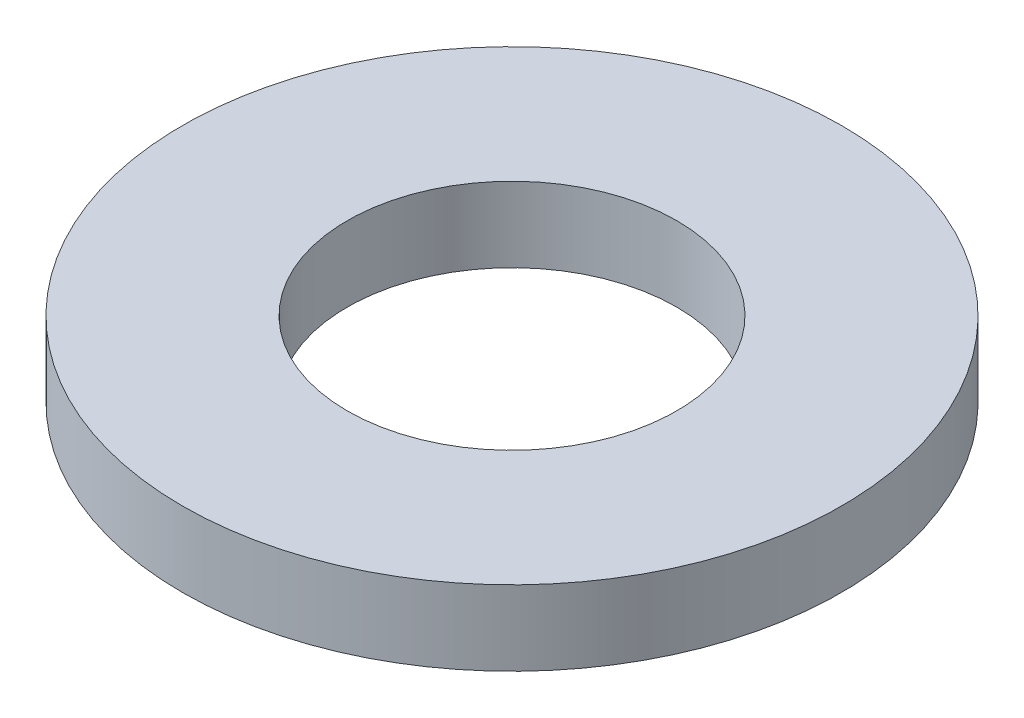
ISO-10303-21;
HEADER;
FILE_DESCRIPTION(('STEP AP214'),'2;1');
FILE_NAME('part.step','',(''),(''),'','','');
FILE_SCHEMA(('AUTOMOTIVE_DESIGN { 1 0 10303 214 1 1 1 1 }'));
ENDSEC;
DATA;
#1=APPLICATION_CONTEXT('core data for automotive mechanical design processes');
#2=APPLICATION_PROTOCOL_DEFINITION('international standard','automotive_design',2000,#1);
#3=PRODUCT_CONTEXT('',#1,'mechanical');
#4=PRODUCT('Part','Part','',(#3));
#5=PRODUCT_RELATED_PRODUCT_CATEGORY('part','',(#4));
#6=PRODUCT_DEFINITION_FORMATION('','',#4);
#7=PRODUCT_DEFINITION_CONTEXT('part definition',#1,'design');
#8=PRODUCT_DEFINITION('design','',#6,#7);
#9=PRODUCT_DEFINITION_SHAPE('','',#8);
#10=(LENGTH_UNIT() NAMED_UNIT(*) SI_UNIT(.MILLI.,.METRE.));
#11=(NAMED_UNIT(*) PLANE_ANGLE_UNIT() SI_UNIT($,.RADIAN.));
#12=(NAMED_UNIT(*) SI_UNIT($,.STERADIAN.) SOLID_ANGLE_UNIT());
#13=UNCERTAINTY_MEASURE_WITH_UNIT(LENGTH_MEASURE(1.E-05),#10,'distance_accuracy_value','');
#14=(GEOMETRIC_REPRESENTATION_CONTEXT(3) GLOBAL_UNCERTAINTY_ASSIGNED_CONTEXT((#13)) GLOBAL_UNIT_ASSIGNED_CONTEXT((#10,
#11,#12)) REPRESENTATION_CONTEXT('',''));
#15=CARTESIAN_POINT('',(0.,0.,0.));
#16=DIRECTION('',(0.,0.,1.));
#17=DIRECTION('',(1.,0.,0.));
#18=AXIS2_PLACEMENT_3D('',#15,#16,#17);
#19=CARTESIAN_POINT('',(0.,12.5,0.));
#20=DIRECTION('',(0.,1.,0.));
#21=DIRECTION('',(0.,0.,1.));
#22=AXIS2_PLACEMENT_3D('',#19,#20,#21);
#23=PLANE('',#22);
#24=CARTESIAN_POINT('',(0.,12.5,0.));
#25=DIRECTION('',(0.,1.,0.));
#26=DIRECTION('',(0.,0.,1.));
#27=AXIS2_PLACEMENT_3D('',#24,#25,#26);
#28=CIRCLE('',#27,110.);
#29=CARTESIAN_POINT('',(0.,12.5,110.));
#30=VERTEX_POINT('',#29);
#31=EDGE_CURVE('E10',#30,#30,#28,.T.);
#32=ORIENTED_EDGE('',*,*,#31,.T.);
#33=EDGE_LOOP('',(#32));
#34=FACE_BOUND('',#33,.T.);
#35=CARTESIAN_POINT('',(0.,12.5,0.));
#36=DIRECTION('',(0.,1.,0.));
#37=DIRECTION('',(0.,0.,1.));
#38=AXIS2_PLACEMENT_3D('',#35,#36,#37);
#39=CIRCLE('',#38,55.);
#40=CARTESIAN_POINT('',(0.,12.5,55.));
#41=VERTEX_POINT('',#40);
#42=EDGE_CURVE('E42',#41,#41,#39,.T.);
#43=ORIENTED_EDGE('',*,*,#42,.F.);
#44=EDGE_LOOP('',(#43));
#45=FACE_BOUND('',#44,.T.);
#46=ADVANCED_FACE('F31',(#34,#45),#23,.T.);
#47=CARTESIAN_POINT('',(0.,-12.5,0.));
#48=DIRECTION('',(0.,1.,0.));
#49=DIRECTION('',(0.,0.,1.));
#50=AXIS2_PLACEMENT_3D('',#47,#48,#49);
#51=PLANE('',#50);
#52=CARTESIAN_POINT('',(0.,-12.5,0.));
#53=DIRECTION('',(0.,1.,0.));
#54=DIRECTION('',(0.,0.,1.));
#55=AXIS2_PLACEMENT_3D('',#52,#53,#54);
#56=CIRCLE('',#55,110.);
#57=CARTESIAN_POINT('',(0.,-12.5,110.));
#58=VERTEX_POINT('',#57);
#59=EDGE_CURVE('E35',#58,#58,#56,.T.);
#60=ORIENTED_EDGE('',*,*,#59,.F.);
#61=EDGE_LOOP('',(#60));
#62=FACE_BOUND('',#61,.T.);
#63=CARTESIAN_POINT('',(0.,-12.5,0.));
#64=DIRECTION('',(0.,1.,0.));
#65=DIRECTION('',(0.,0.,1.));
#66=AXIS2_PLACEMENT_3D('',#63,#64,#65);
#67=CIRCLE('',#66,55.);
#68=CARTESIAN_POINT('',(0.,-12.5,55.));
#69=VERTEX_POINT('',#68);
#70=EDGE_CURVE('E44',#69,#69,#67,.T.);
#71=ORIENTED_EDGE('',*,*,#70,.T.);
#72=EDGE_LOOP('',(#71));
#73=FACE_BOUND('',#72,.T.);
#74=ADVANCED_FACE('F54',(#62,#73),#51,.F.);
#75=CARTESIAN_POINT('',(0.,12.5,0.));
#76=DIRECTION('',(0.,-1.,0.));
#77=DIRECTION('',(0.,0.,-1.));
#78=AXIS2_PLACEMENT_3D('',#75,#76,#77);
#79=CYLINDRICAL_SURFACE('',#78,110.);
#80=ORIENTED_EDGE('',*,*,#31,.F.);
#81=EDGE_LOOP('',(#80));
#82=FACE_BOUND('',#81,.T.);
#83=ORIENTED_EDGE('',*,*,#59,.T.);
#84=EDGE_LOOP('',(#83));
#85=FACE_BOUND('',#84,.T.);
#86=ADVANCED_FACE('F33',(#82,#85),#79,.T.);
#87=CARTESIAN_POINT('',(0.,12.5,0.));
#88=DIRECTION('',(0.,-1.,0.));
#89=DIRECTION('',(0.,0.,-1.));
#90=AXIS2_PLACEMENT_3D('',#87,#88,#89);
#91=CYLINDRICAL_SURFACE('',#90,55.);
#92=ORIENTED_EDGE('',*,*,#42,.T.);
#93=EDGE_LOOP('',(#92));
#94=FACE_BOUND('',#93,.T.);
#95=ORIENTED_EDGE('',*,*,#70,.F.);
#96=EDGE_LOOP('',(#95));
#97=FACE_BOUND('',#96,.T.);
#98=ADVANCED_FACE('F50',(#94,#97),#91,.F.);
#99=CLOSED_SHELL('',(#46,#74,#86,#98));
#100=MANIFOLD_SOLID_BREP('B2',#99);
#101=ADVANCED_BREP_SHAPE_REPRESENTATION('',(#18,#100),#14);
#102=SHAPE_DEFINITION_REPRESENTATION(#9,#101);
ENDSEC;
END-ISO-10303-21;
